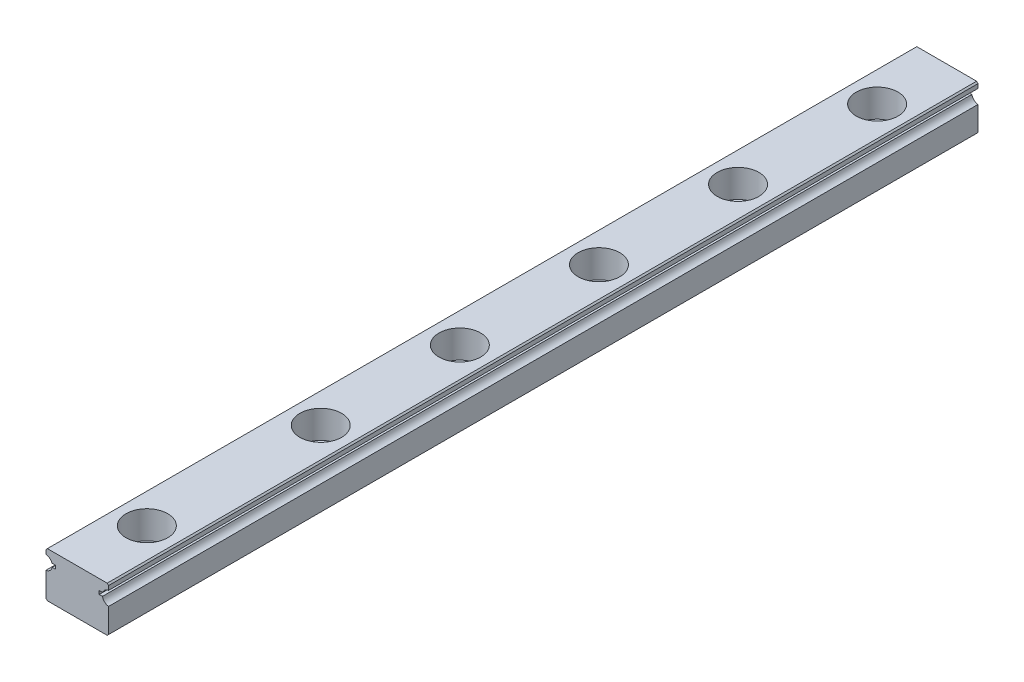
ISO-10303-21;
HEADER;
FILE_DESCRIPTION(('STEP AP214'),'2;1');
FILE_NAME('part.step','',(''),(''),'','','');
FILE_SCHEMA(('AUTOMOTIVE_DESIGN { 1 0 10303 214 1 1 1 1 }'));
ENDSEC;
DATA;
#1=APPLICATION_CONTEXT('core data for automotive mechanical design processes');
#2=APPLICATION_PROTOCOL_DEFINITION('international standard','automotive_design',2000,#1);
#3=PRODUCT_CONTEXT('',#1,'mechanical');
#4=PRODUCT('Part','Part','',(#3));
#5=PRODUCT_RELATED_PRODUCT_CATEGORY('part','',(#4));
#6=PRODUCT_DEFINITION_FORMATION('','',#4);
#7=PRODUCT_DEFINITION_CONTEXT('part definition',#1,'design');
#8=PRODUCT_DEFINITION('design','',#6,#7);
#9=PRODUCT_DEFINITION_SHAPE('','',#8);
#10=(LENGTH_UNIT() NAMED_UNIT(*) SI_UNIT(.MILLI.,.METRE.));
#11=(NAMED_UNIT(*) PLANE_ANGLE_UNIT() SI_UNIT($,.RADIAN.));
#12=(NAMED_UNIT(*) SI_UNIT($,.STERADIAN.) SOLID_ANGLE_UNIT());
#13=UNCERTAINTY_MEASURE_WITH_UNIT(LENGTH_MEASURE(1.E-05),#10,'distance_accuracy_value','');
#14=(GEOMETRIC_REPRESENTATION_CONTEXT(3) GLOBAL_UNCERTAINTY_ASSIGNED_CONTEXT((#13)) GLOBAL_UNIT_ASSIGNED_CONTEXT((#10,
#11,#12)) REPRESENTATION_CONTEXT('',''));
#15=CARTESIAN_POINT('',(0.,0.,0.));
#16=DIRECTION('',(0.,0.,1.));
#17=DIRECTION('',(1.,0.,0.));
#18=AXIS2_PLACEMENT_3D('',#15,#16,#17);
#19=CARTESIAN_POINT('',(-4.3,3.25,125.));
#20=DIRECTION('',(0.,-1.,0.));
#21=DIRECTION('',(0.,0.,-1.));
#22=AXIS2_PLACEMENT_3D('',#19,#20,#21);
#23=PLANE('',#22);
#24=CARTESIAN_POINT('',(1.45716771982052E-13,3.25,90.));
#25=DIRECTION('',(0.,1.,0.));
#26=DIRECTION('',(0.,0.,1.));
#27=AXIS2_PLACEMENT_3D('',#24,#25,#26);
#28=CIRCLE('',#27,3.);
#29=CARTESIAN_POINT('',(1.45716771982052E-13,3.25,93.));
#30=VERTEX_POINT('',#29);
#31=EDGE_CURVE('E717',#30,#30,#28,.T.);
#32=ORIENTED_EDGE('',*,*,#31,.F.);
#33=EDGE_LOOP('',(#32));
#34=FACE_BOUND('',#33,.T.);
#35=CARTESIAN_POINT('',(0.,3.25,50.));
#36=DIRECTION('',(0.,1.,0.));
#37=DIRECTION('',(0.,0.,1.));
#38=AXIS2_PLACEMENT_3D('',#35,#36,#37);
#39=CIRCLE('',#38,3.);
#40=CARTESIAN_POINT('',(0.,3.25,53.));
#41=VERTEX_POINT('',#40);
#42=EDGE_CURVE('E739',#41,#41,#39,.T.);
#43=ORIENTED_EDGE('',*,*,#42,.F.);
#44=EDGE_LOOP('',(#43));
#45=FACE_BOUND('',#44,.T.);
#46=CARTESIAN_POINT('',(0.,3.25,30.));
#47=DIRECTION('',(0.,1.,0.));
#48=DIRECTION('',(0.,0.,1.));
#49=AXIS2_PLACEMENT_3D('',#46,#47,#48);
#50=CIRCLE('',#49,3.);
#51=CARTESIAN_POINT('',(0.,3.25,33.));
#52=VERTEX_POINT('',#51);
#53=EDGE_CURVE('E751',#52,#52,#50,.T.);
#54=ORIENTED_EDGE('',*,*,#53,.F.);
#55=EDGE_LOOP('',(#54));
#56=FACE_BOUND('',#55,.T.);
#57=CARTESIAN_POINT('',(0.,3.25,115.));
#58=DIRECTION('',(0.,1.,0.));
#59=DIRECTION('',(0.,0.,1.));
#60=AXIS2_PLACEMENT_3D('',#57,#58,#59);
#61=CIRCLE('',#60,3.);
#62=CARTESIAN_POINT('',(0.,3.25,118.));
#63=VERTEX_POINT('',#62);
#64=EDGE_CURVE('E763',#63,#63,#61,.T.);
#65=ORIENTED_EDGE('',*,*,#64,.F.);
#66=EDGE_LOOP('',(#65));
#67=FACE_BOUND('',#66,.T.);
#68=CARTESIAN_POINT('',(0.,3.25,10.));
#69=DIRECTION('',(0.,1.,0.));
#70=DIRECTION('',(0.,0.,1.));
#71=AXIS2_PLACEMENT_3D('',#68,#69,#70);
#72=CIRCLE('',#71,3.);
#73=CARTESIAN_POINT('',(0.,3.25,13.));
#74=VERTEX_POINT('',#73);
#75=EDGE_CURVE('E775',#74,#74,#72,.T.);
#76=ORIENTED_EDGE('',*,*,#75,.F.);
#77=EDGE_LOOP('',(#76));
#78=FACE_BOUND('',#77,.T.);
#79=DIRECTION('',(-1.,0.,0.));
#80=VECTOR('',#79,1.);
#81=CARTESIAN_POINT('',(-4.3,3.25,0.));
#82=LINE('',#81,#80);
#83=CARTESIAN_POINT('',(4.3,3.25,0.));
#84=VERTEX_POINT('',#83);
#85=CARTESIAN_POINT('',(-4.3,3.25,0.));
#86=VERTEX_POINT('',#85);
#87=EDGE_CURVE('E200',#84,#86,#82,.T.);
#88=ORIENTED_EDGE('',*,*,#87,.T.);
#89=DIRECTION('',(0.,0.,-1.));
#90=VECTOR('',#89,1.);
#91=CARTESIAN_POINT('',(-4.3,3.25,125.));
#92=LINE('',#91,#90);
#93=CARTESIAN_POINT('',(-4.3,3.25,125.));
#94=VERTEX_POINT('',#93);
#95=EDGE_CURVE('E197',#94,#86,#92,.T.);
#96=ORIENTED_EDGE('',*,*,#95,.F.);
#97=DIRECTION('',(-1.,0.,0.));
#98=VECTOR('',#97,1.);
#99=CARTESIAN_POINT('',(-4.3,3.25,125.));
#100=LINE('',#99,#98);
#101=CARTESIAN_POINT('',(4.3,3.25,125.));
#102=VERTEX_POINT('',#101);
#103=EDGE_CURVE('E186',#102,#94,#100,.T.);
#104=ORIENTED_EDGE('',*,*,#103,.F.);
#105=DIRECTION('',(0.,0.,-1.));
#106=VECTOR('',#105,1.);
#107=CARTESIAN_POINT('',(4.3,3.25,125.));
#108=LINE('',#107,#106);
#109=EDGE_CURVE('E201',#102,#84,#108,.T.);
#110=ORIENTED_EDGE('',*,*,#109,.T.);
#111=EDGE_LOOP('',(#88,#96,#104,#110));
#112=FACE_BOUND('',#111,.T.);
#113=CARTESIAN_POINT('',(0.,3.25,70.));
#114=DIRECTION('',(0.,1.,0.));
#115=DIRECTION('',(0.,0.,1.));
#116=AXIS2_PLACEMENT_3D('',#113,#114,#115);
#117=CIRCLE('',#116,3.);
#118=CARTESIAN_POINT('',(0.,3.25,73.));
#119=VERTEX_POINT('',#118);
#120=EDGE_CURVE('E727',#119,#119,#117,.T.);
#121=ORIENTED_EDGE('',*,*,#120,.F.);
#122=EDGE_LOOP('',(#121));
#123=FACE_BOUND('',#122,.T.);
#124=ADVANCED_FACE('F41',(#34,#45,#56,#67,#78,#112,#123),#23,.F.);
#125=CARTESIAN_POINT('',(-4.6,1.45,125.));
#126=DIRECTION('',(0.,0.,-1.));
#127=DIRECTION('',(-1.,0.,0.));
#128=AXIS2_PLACEMENT_3D('',#125,#126,#127);
#129=CYLINDRICAL_SURFACE('',#128,1.);
#130=CARTESIAN_POINT('',(-4.6,1.45,0.));
#131=DIRECTION('',(0.,0.,-1.));
#132=DIRECTION('',(-1.,0.,0.));
#133=AXIS2_PLACEMENT_3D('',#130,#131,#132);
#134=CIRCLE('',#133,1.);
#135=CARTESIAN_POINT('',(-4.5,2.44498743710662,0.));
#136=VERTEX_POINT('',#135);
#137=CARTESIAN_POINT('',(-3.65008224040183,1.7625,0.));
#138=VERTEX_POINT('',#137);
#139=EDGE_CURVE('E210',#136,#138,#134,.T.);
#140=ORIENTED_EDGE('',*,*,#139,.T.);
#141=DIRECTION('',(0.,0.,-1.));
#142=VECTOR('',#141,1.);
#143=CARTESIAN_POINT('',(-3.65008224040183,1.7625,125.));
#144=LINE('',#143,#142);
#145=CARTESIAN_POINT('',(-3.65008224040183,1.7625,125.));
#146=VERTEX_POINT('',#145);
#147=EDGE_CURVE('E12',#146,#138,#144,.T.);
#148=ORIENTED_EDGE('',*,*,#147,.F.);
#149=CARTESIAN_POINT('',(-4.6,1.45,125.));
#150=DIRECTION('',(0.,0.,-1.));
#151=DIRECTION('',(-1.,0.,0.));
#152=AXIS2_PLACEMENT_3D('',#149,#150,#151);
#153=CIRCLE('',#152,1.);
#154=CARTESIAN_POINT('',(-4.5,2.44498743710662,125.));
#155=VERTEX_POINT('',#154);
#156=EDGE_CURVE('E249',#155,#146,#153,.T.);
#157=ORIENTED_EDGE('',*,*,#156,.F.);
#158=DIRECTION('',(0.,0.,-1.));
#159=VECTOR('',#158,1.);
#160=CARTESIAN_POINT('',(-4.5,2.44498743710662,125.));
#161=LINE('',#160,#159);
#162=EDGE_CURVE('E206',#155,#136,#161,.T.);
#163=ORIENTED_EDGE('',*,*,#162,.T.);
#164=EDGE_LOOP('',(#140,#148,#157,#163));
#165=FACE_BOUND('',#164,.T.);
#166=ADVANCED_FACE('F43',(#165),#129,.F.);
#167=CARTESIAN_POINT('',(-3.65008224040183,1.7625,125.));
#168=DIRECTION('',(0.,1.,0.));
#169=DIRECTION('',(0.,0.,1.));
#170=AXIS2_PLACEMENT_3D('',#167,#168,#169);
#171=PLANE('',#170);
#172=DIRECTION('',(1.,0.,0.));
#173=VECTOR('',#172,1.);
#174=CARTESIAN_POINT('',(-3.65008224040183,1.7625,0.));
#175=LINE('',#174,#173);
#176=CARTESIAN_POINT('',(-3.15008224040183,1.7625,0.));
#177=VERTEX_POINT('',#176);
#178=EDGE_CURVE('E213',#138,#177,#175,.T.);
#179=ORIENTED_EDGE('',*,*,#178,.T.);
#180=DIRECTION('',(0.,0.,-1.));
#181=VECTOR('',#180,1.);
#182=CARTESIAN_POINT('',(-3.15008224040183,1.7625,125.));
#183=LINE('',#182,#181);
#184=CARTESIAN_POINT('',(-3.15008224040183,1.7625,125.));
#185=VERTEX_POINT('',#184);
#186=EDGE_CURVE('E50',#185,#177,#183,.T.);
#187=ORIENTED_EDGE('',*,*,#186,.F.);
#188=DIRECTION('',(1.,0.,0.));
#189=VECTOR('',#188,1.);
#190=CARTESIAN_POINT('',(-3.65008224040183,1.7625,125.));
#191=LINE('',#190,#189);
#192=EDGE_CURVE('E137',#146,#185,#191,.T.);
#193=ORIENTED_EDGE('',*,*,#192,.F.);
#194=ORIENTED_EDGE('',*,*,#147,.T.);
#195=EDGE_LOOP('',(#179,#187,#193,#194));
#196=FACE_BOUND('',#195,.T.);
#197=ADVANCED_FACE('F384',(#196),#171,.F.);
#198=CARTESIAN_POINT('',(-3.15008224040183,1.2625,125.));
#199=DIRECTION('',(1.,0.,0.));
#200=DIRECTION('',(0.,0.,-1.));
#201=AXIS2_PLACEMENT_3D('',#198,#199,#200);
#202=PLANE('',#201);
#203=DIRECTION('',(0.,-1.,0.));
#204=VECTOR('',#203,1.);
#205=CARTESIAN_POINT('',(-3.15008224040183,1.2625,0.));
#206=LINE('',#205,#204);
#207=CARTESIAN_POINT('',(-3.15008224040183,1.2625,0.));
#208=VERTEX_POINT('',#207);
#209=EDGE_CURVE('E216',#177,#208,#206,.T.);
#210=ORIENTED_EDGE('',*,*,#209,.T.);
#211=DIRECTION('',(0.,0.,-1.));
#212=VECTOR('',#211,1.);
#213=CARTESIAN_POINT('',(-3.15008224040183,1.2625,125.));
#214=LINE('',#213,#212);
#215=CARTESIAN_POINT('',(-3.15008224040183,1.2625,125.));
#216=VERTEX_POINT('',#215);
#217=EDGE_CURVE('E304',#216,#208,#214,.T.);
#218=ORIENTED_EDGE('',*,*,#217,.F.);
#219=DIRECTION('',(0.,-1.,0.));
#220=VECTOR('',#219,1.);
#221=CARTESIAN_POINT('',(-3.15008224040183,1.2625,125.));
#222=LINE('',#221,#220);
#223=EDGE_CURVE('E312',#185,#216,#222,.T.);
#224=ORIENTED_EDGE('',*,*,#223,.F.);
#225=ORIENTED_EDGE('',*,*,#186,.T.);
#226=EDGE_LOOP('',(#210,#218,#224,#225));
#227=FACE_BOUND('',#226,.T.);
#228=ADVANCED_FACE('F310',(#227),#202,.F.);
#229=CARTESIAN_POINT('',(-3.61773539715614,1.2625,125.));
#230=DIRECTION('',(0.,-1.,0.));
#231=DIRECTION('',(0.,0.,-1.));
#232=AXIS2_PLACEMENT_3D('',#229,#230,#231);
#233=PLANE('',#232);
#234=DIRECTION('',(-1.,0.,0.));
#235=VECTOR('',#234,1.);
#236=CARTESIAN_POINT('',(-3.61773539715614,1.2625,0.));
#237=LINE('',#236,#235);
#238=CARTESIAN_POINT('',(-3.61773539715614,1.2625,0.));
#239=VERTEX_POINT('',#238);
#240=EDGE_CURVE('E218',#208,#239,#237,.T.);
#241=ORIENTED_EDGE('',*,*,#240,.T.);
#242=DIRECTION('',(0.,0.,-1.));
#243=VECTOR('',#242,1.);
#244=CARTESIAN_POINT('',(-3.61773539715614,1.2625,125.));
#245=LINE('',#244,#243);
#246=CARTESIAN_POINT('',(-3.61773539715614,1.2625,125.));
#247=VERTEX_POINT('',#246);
#248=EDGE_CURVE('E301',#247,#239,#245,.T.);
#249=ORIENTED_EDGE('',*,*,#248,.F.);
#250=DIRECTION('',(-1.,0.,0.));
#251=VECTOR('',#250,1.);
#252=CARTESIAN_POINT('',(-3.61773539715614,1.2625,125.));
#253=LINE('',#252,#251);
#254=EDGE_CURVE('E330',#216,#247,#253,.T.);
#255=ORIENTED_EDGE('',*,*,#254,.F.);
#256=ORIENTED_EDGE('',*,*,#217,.T.);
#257=EDGE_LOOP('',(#241,#249,#255,#256));
#258=FACE_BOUND('',#257,.T.);
#259=ADVANCED_FACE('F321',(#258),#233,.F.);
#260=CARTESIAN_POINT('',(-4.6,1.45,125.));
#261=DIRECTION('',(0.,0.,-1.));
#262=DIRECTION('',(-1.,0.,0.));
#263=AXIS2_PLACEMENT_3D('',#260,#261,#262);
#264=CYLINDRICAL_SURFACE('',#263,1.);
#265=CARTESIAN_POINT('',(-4.6,1.45,0.));
#266=DIRECTION('',(0.,0.,-1.));
#267=DIRECTION('',(-1.,0.,0.));
#268=AXIS2_PLACEMENT_3D('',#265,#266,#267);
#269=CIRCLE('',#268,1.);
#270=CARTESIAN_POINT('',(-4.5,0.455012562893381,0.));
#271=VERTEX_POINT('',#270);
#272=EDGE_CURVE('E220',#239,#271,#269,.T.);
#273=ORIENTED_EDGE('',*,*,#272,.T.);
#274=DIRECTION('',(0.,0.,-1.));
#275=VECTOR('',#274,1.);
#276=CARTESIAN_POINT('',(-4.5,0.455012562893381,125.));
#277=LINE('',#276,#275);
#278=CARTESIAN_POINT('',(-4.5,0.455012562893381,125.));
#279=VERTEX_POINT('',#278);
#280=EDGE_CURVE('E298',#279,#271,#277,.T.);
#281=ORIENTED_EDGE('',*,*,#280,.F.);
#282=CARTESIAN_POINT('',(-4.6,1.45,125.));
#283=DIRECTION('',(0.,0.,-1.));
#284=DIRECTION('',(-1.,0.,0.));
#285=AXIS2_PLACEMENT_3D('',#282,#283,#284);
#286=CIRCLE('',#285,1.);
#287=EDGE_CURVE('E327',#247,#279,#286,.T.);
#288=ORIENTED_EDGE('',*,*,#287,.F.);
#289=ORIENTED_EDGE('',*,*,#248,.T.);
#290=EDGE_LOOP('',(#273,#281,#288,#289));
#291=FACE_BOUND('',#290,.T.);
#292=ADVANCED_FACE('F325',(#291),#264,.F.);
#293=CARTESIAN_POINT('',(-4.5,-3.05,125.));
#294=DIRECTION('',(1.,0.,0.));
#295=DIRECTION('',(0.,1.,0.));
#296=AXIS2_PLACEMENT_3D('',#293,#294,#295);
#297=PLANE('',#296);
#298=DIRECTION('',(0.,-1.,0.));
#299=VECTOR('',#298,1.);
#300=CARTESIAN_POINT('',(-4.5,-3.05,0.));
#301=LINE('',#300,#299);
#302=CARTESIAN_POINT('',(-4.5,-3.05,0.));
#303=VERTEX_POINT('',#302);
#304=EDGE_CURVE('E222',#271,#303,#301,.T.);
#305=ORIENTED_EDGE('',*,*,#304,.T.);
#306=DIRECTION('',(0.,0.,-1.));
#307=VECTOR('',#306,1.);
#308=CARTESIAN_POINT('',(-4.5,-3.05,125.));
#309=LINE('',#308,#307);
#310=CARTESIAN_POINT('',(-4.5,-3.05,125.));
#311=VERTEX_POINT('',#310);
#312=EDGE_CURVE('E294',#311,#303,#309,.T.);
#313=ORIENTED_EDGE('',*,*,#312,.F.);
#314=DIRECTION('',(0.,-1.,0.));
#315=VECTOR('',#314,1.);
#316=CARTESIAN_POINT('',(-4.5,-3.05,125.));
#317=LINE('',#316,#315);
#318=EDGE_CURVE('E329',#279,#311,#317,.T.);
#319=ORIENTED_EDGE('',*,*,#318,.F.);
#320=ORIENTED_EDGE('',*,*,#280,.T.);
#321=EDGE_LOOP('',(#305,#313,#319,#320));
#322=FACE_BOUND('',#321,.T.);
#323=ADVANCED_FACE('F427',(#322),#297,.F.);
#324=CARTESIAN_POINT('',(-4.5,-3.05,125.));
#325=DIRECTION('',(0.707106781186549,0.707106781186546,0.));
#326=DIRECTION('',(-0.707106781186546,0.707106781186549,0.));
#327=AXIS2_PLACEMENT_3D('',#324,#325,#326);
#328=PLANE('',#327);
#329=DIRECTION('',(0.707106781186546,-0.707106781186549,0.));
#330=VECTOR('',#329,1.);
#331=CARTESIAN_POINT('',(-4.5,-3.05,0.));
#332=LINE('',#331,#330);
#333=CARTESIAN_POINT('',(-4.3,-3.25,0.));
#334=VERTEX_POINT('',#333);
#335=EDGE_CURVE('E224',#303,#334,#332,.T.);
#336=ORIENTED_EDGE('',*,*,#335,.T.);
#337=DIRECTION('',(0.,0.,-1.));
#338=VECTOR('',#337,1.);
#339=CARTESIAN_POINT('',(-4.3,-3.25,125.));
#340=LINE('',#339,#338);
#341=CARTESIAN_POINT('',(-4.3,-3.25,125.));
#342=VERTEX_POINT('',#341);
#343=EDGE_CURVE('E290',#342,#334,#340,.T.);
#344=ORIENTED_EDGE('',*,*,#343,.F.);
#345=DIRECTION('',(0.707106781186546,-0.707106781186549,0.));
#346=VECTOR('',#345,1.);
#347=CARTESIAN_POINT('',(-4.5,-3.05,125.));
#348=LINE('',#347,#346);
#349=EDGE_CURVE('E332',#311,#342,#348,.T.);
#350=ORIENTED_EDGE('',*,*,#349,.F.);
#351=ORIENTED_EDGE('',*,*,#312,.T.);
#352=EDGE_LOOP('',(#336,#344,#350,#351));
#353=FACE_BOUND('',#352,.T.);
#354=ADVANCED_FACE('F423',(#353),#328,.F.);
#355=CARTESIAN_POINT('',(-4.3,-3.25,125.));
#356=DIRECTION('',(0.,1.,0.));
#357=DIRECTION('',(0.,0.,1.));
#358=AXIS2_PLACEMENT_3D('',#355,#356,#357);
#359=PLANE('',#358);
#360=CARTESIAN_POINT('',(1.45716771982052E-13,-3.25,90.));
#361=DIRECTION('',(0.,1.,0.));
#362=DIRECTION('',(0.,0.,1.));
#363=AXIS2_PLACEMENT_3D('',#360,#361,#362);
#364=CIRCLE('',#363,1.75);
#365=CARTESIAN_POINT('',(1.45716771982052E-13,-3.25,91.75));
#366=VERTEX_POINT('',#365);
#367=EDGE_CURVE('E724',#366,#366,#364,.T.);
#368=ORIENTED_EDGE('',*,*,#367,.T.);
#369=EDGE_LOOP('',(#368));
#370=FACE_BOUND('',#369,.T.);
#371=CARTESIAN_POINT('',(0.,-3.25,70.));
#372=DIRECTION('',(0.,1.,0.));
#373=DIRECTION('',(0.,0.,1.));
#374=AXIS2_PLACEMENT_3D('',#371,#372,#373);
#375=CIRCLE('',#374,1.75);
#376=CARTESIAN_POINT('',(0.,-3.25,71.75));
#377=VERTEX_POINT('',#376);
#378=EDGE_CURVE('E736',#377,#377,#375,.T.);
#379=ORIENTED_EDGE('',*,*,#378,.T.);
#380=EDGE_LOOP('',(#379));
#381=FACE_BOUND('',#380,.T.);
#382=CARTESIAN_POINT('',(0.,-3.25,50.));
#383=DIRECTION('',(0.,1.,0.));
#384=DIRECTION('',(0.,0.,1.));
#385=AXIS2_PLACEMENT_3D('',#382,#383,#384);
#386=CIRCLE('',#385,1.75);
#387=CARTESIAN_POINT('',(0.,-3.25,51.75));
#388=VERTEX_POINT('',#387);
#389=EDGE_CURVE('E748',#388,#388,#386,.T.);
#390=ORIENTED_EDGE('',*,*,#389,.T.);
#391=EDGE_LOOP('',(#390));
#392=FACE_BOUND('',#391,.T.);
#393=CARTESIAN_POINT('',(0.,-3.25,30.));
#394=DIRECTION('',(0.,1.,0.));
#395=DIRECTION('',(0.,0.,1.));
#396=AXIS2_PLACEMENT_3D('',#393,#394,#395);
#397=CIRCLE('',#396,1.75);
#398=CARTESIAN_POINT('',(0.,-3.25,31.75));
#399=VERTEX_POINT('',#398);
#400=EDGE_CURVE('E760',#399,#399,#397,.T.);
#401=ORIENTED_EDGE('',*,*,#400,.T.);
#402=EDGE_LOOP('',(#401));
#403=FACE_BOUND('',#402,.T.);
#404=CARTESIAN_POINT('',(0.,-3.25,115.));
#405=DIRECTION('',(0.,1.,0.));
#406=DIRECTION('',(0.,0.,1.));
#407=AXIS2_PLACEMENT_3D('',#404,#405,#406);
#408=CIRCLE('',#407,1.75);
#409=CARTESIAN_POINT('',(0.,-3.25,116.75));
#410=VERTEX_POINT('',#409);
#411=EDGE_CURVE('E772',#410,#410,#408,.T.);
#412=ORIENTED_EDGE('',*,*,#411,.T.);
#413=EDGE_LOOP('',(#412));
#414=FACE_BOUND('',#413,.T.);
#415=CARTESIAN_POINT('',(0.,-3.25,10.));
#416=DIRECTION('',(0.,1.,0.));
#417=DIRECTION('',(0.,0.,1.));
#418=AXIS2_PLACEMENT_3D('',#415,#416,#417);
#419=CIRCLE('',#418,1.75);
#420=CARTESIAN_POINT('',(0.,-3.25,11.75));
#421=VERTEX_POINT('',#420);
#422=EDGE_CURVE('E214',#421,#421,#419,.T.);
#423=ORIENTED_EDGE('',*,*,#422,.T.);
#424=EDGE_LOOP('',(#423));
#425=FACE_BOUND('',#424,.T.);
#426=DIRECTION('',(1.,0.,0.));
#427=VECTOR('',#426,1.);
#428=CARTESIAN_POINT('',(-4.3,-3.25,0.));
#429=LINE('',#428,#427);
#430=CARTESIAN_POINT('',(4.3,-3.25,0.));
#431=VERTEX_POINT('',#430);
#432=EDGE_CURVE('E226',#334,#431,#429,.T.);
#433=ORIENTED_EDGE('',*,*,#432,.T.);
#434=DIRECTION('',(0.,0.,-1.));
#435=VECTOR('',#434,1.);
#436=CARTESIAN_POINT('',(4.3,-3.25,125.));
#437=LINE('',#436,#435);
#438=CARTESIAN_POINT('',(4.3,-3.25,125.));
#439=VERTEX_POINT('',#438);
#440=EDGE_CURVE('E286',#439,#431,#437,.T.);
#441=ORIENTED_EDGE('',*,*,#440,.F.);
#442=DIRECTION('',(1.,0.,0.));
#443=VECTOR('',#442,1.);
#444=CARTESIAN_POINT('',(-4.3,-3.25,125.));
#445=LINE('',#444,#443);
#446=EDGE_CURVE('E338',#342,#439,#445,.T.);
#447=ORIENTED_EDGE('',*,*,#446,.F.);
#448=ORIENTED_EDGE('',*,*,#343,.T.);
#449=EDGE_LOOP('',(#433,#441,#447,#448));
#450=FACE_BOUND('',#449,.T.);
#451=ADVANCED_FACE('F419',(#370,#381,#392,#403,#414,#425,#450),#359,.F.);
#452=CARTESIAN_POINT('',(4.3,-3.25,125.));
#453=DIRECTION('',(-0.707106781186547,0.707106781186548,0.));
#454=DIRECTION('',(-0.707106781186548,-0.707106781186547,0.));
#455=AXIS2_PLACEMENT_3D('',#452,#453,#454);
#456=PLANE('',#455);
#457=DIRECTION('',(0.707106781186548,0.707106781186547,0.));
#458=VECTOR('',#457,1.);
#459=CARTESIAN_POINT('',(4.3,-3.25,0.));
#460=LINE('',#459,#458);
#461=CARTESIAN_POINT('',(4.5,-3.05,0.));
#462=VERTEX_POINT('',#461);
#463=EDGE_CURVE('E228',#431,#462,#460,.T.);
#464=ORIENTED_EDGE('',*,*,#463,.T.);
#465=DIRECTION('',(0.,0.,-1.));
#466=VECTOR('',#465,1.);
#467=CARTESIAN_POINT('',(4.5,-3.05,125.));
#468=LINE('',#467,#466);
#469=CARTESIAN_POINT('',(4.5,-3.05,125.));
#470=VERTEX_POINT('',#469);
#471=EDGE_CURVE('E282',#470,#462,#468,.T.);
#472=ORIENTED_EDGE('',*,*,#471,.F.);
#473=DIRECTION('',(0.707106781186548,0.707106781186547,0.));
#474=VECTOR('',#473,1.);
#475=CARTESIAN_POINT('',(4.3,-3.25,125.));
#476=LINE('',#475,#474);
#477=EDGE_CURVE('E340',#439,#470,#476,.T.);
#478=ORIENTED_EDGE('',*,*,#477,.F.);
#479=ORIENTED_EDGE('',*,*,#440,.T.);
#480=EDGE_LOOP('',(#464,#472,#478,#479));
#481=FACE_BOUND('',#480,.T.);
#482=ADVANCED_FACE('F415',(#481),#456,.F.);
#483=CARTESIAN_POINT('',(4.5,-3.05,125.));
#484=DIRECTION('',(-1.,0.,0.));
#485=DIRECTION('',(0.,-1.,0.));
#486=AXIS2_PLACEMENT_3D('',#483,#484,#485);
#487=PLANE('',#486);
#488=DIRECTION('',(0.,1.,0.));
#489=VECTOR('',#488,1.);
#490=CARTESIAN_POINT('',(4.5,-3.05,0.));
#491=LINE('',#490,#489);
#492=CARTESIAN_POINT('',(4.5,0.455012562893381,0.));
#493=VERTEX_POINT('',#492);
#494=EDGE_CURVE('E230',#462,#493,#491,.T.);
#495=ORIENTED_EDGE('',*,*,#494,.T.);
#496=DIRECTION('',(0.,0.,-1.));
#497=VECTOR('',#496,1.);
#498=CARTESIAN_POINT('',(4.5,0.455012562893381,125.));
#499=LINE('',#498,#497);
#500=CARTESIAN_POINT('',(4.5,0.455012562893381,125.));
#501=VERTEX_POINT('',#500);
#502=EDGE_CURVE('E278',#501,#493,#499,.T.);
#503=ORIENTED_EDGE('',*,*,#502,.F.);
#504=DIRECTION('',(0.,1.,0.));
#505=VECTOR('',#504,1.);
#506=CARTESIAN_POINT('',(4.5,-3.05,125.));
#507=LINE('',#506,#505);
#508=EDGE_CURVE('E342',#470,#501,#507,.T.);
#509=ORIENTED_EDGE('',*,*,#508,.F.);
#510=ORIENTED_EDGE('',*,*,#471,.T.);
#511=EDGE_LOOP('',(#495,#503,#509,#510));
#512=FACE_BOUND('',#511,.T.);
#513=ADVANCED_FACE('F411',(#512),#487,.F.);
#514=CARTESIAN_POINT('',(4.6,1.45,125.));
#515=DIRECTION('',(0.,0.,-1.));
#516=DIRECTION('',(-1.,0.,0.));
#517=AXIS2_PLACEMENT_3D('',#514,#515,#516);
#518=CYLINDRICAL_SURFACE('',#517,1.);
#519=CARTESIAN_POINT('',(4.6,1.45,0.));
#520=DIRECTION('',(0.,0.,-1.));
#521=DIRECTION('',(1.,0.,0.));
#522=AXIS2_PLACEMENT_3D('',#519,#520,#521);
#523=CIRCLE('',#522,1.);
#524=CARTESIAN_POINT('',(3.61773539715614,1.2625,0.));
#525=VERTEX_POINT('',#524);
#526=EDGE_CURVE('E232',#493,#525,#523,.T.);
#527=ORIENTED_EDGE('',*,*,#526,.T.);
#528=DIRECTION('',(0.,0.,-1.));
#529=VECTOR('',#528,1.);
#530=CARTESIAN_POINT('',(3.61773539715614,1.2625,125.));
#531=LINE('',#530,#529);
#532=CARTESIAN_POINT('',(3.61773539715614,1.2625,125.));
#533=VERTEX_POINT('',#532);
#534=EDGE_CURVE('E274',#533,#525,#531,.T.);
#535=ORIENTED_EDGE('',*,*,#534,.F.);
#536=CARTESIAN_POINT('',(4.6,1.45,125.));
#537=DIRECTION('',(0.,0.,-1.));
#538=DIRECTION('',(1.,0.,0.));
#539=AXIS2_PLACEMENT_3D('',#536,#537,#538);
#540=CIRCLE('',#539,1.);
#541=EDGE_CURVE('E344',#501,#533,#540,.T.);
#542=ORIENTED_EDGE('',*,*,#541,.F.);
#543=ORIENTED_EDGE('',*,*,#502,.T.);
#544=EDGE_LOOP('',(#527,#535,#542,#543));
#545=FACE_BOUND('',#544,.T.);
#546=ADVANCED_FACE('F407',(#545),#518,.F.);
#547=CARTESIAN_POINT('',(3.61773539715614,1.2625,125.));
#548=DIRECTION('',(0.,-1.,0.));
#549=DIRECTION('',(0.,0.,-1.));
#550=AXIS2_PLACEMENT_3D('',#547,#548,#549);
#551=PLANE('',#550);
#552=DIRECTION('',(-1.,0.,0.));
#553=VECTOR('',#552,1.);
#554=CARTESIAN_POINT('',(3.61773539715614,1.2625,0.));
#555=LINE('',#554,#553);
#556=CARTESIAN_POINT('',(3.15008224040183,1.2625,0.));
#557=VERTEX_POINT('',#556);
#558=EDGE_CURVE('E234',#525,#557,#555,.T.);
#559=ORIENTED_EDGE('',*,*,#558,.T.);
#560=DIRECTION('',(0.,0.,-1.));
#561=VECTOR('',#560,1.);
#562=CARTESIAN_POINT('',(3.15008224040183,1.2625,125.));
#563=LINE('',#562,#561);
#564=CARTESIAN_POINT('',(3.15008224040183,1.2625,125.));
#565=VERTEX_POINT('',#564);
#566=EDGE_CURVE('E270',#565,#557,#563,.T.);
#567=ORIENTED_EDGE('',*,*,#566,.F.);
#568=DIRECTION('',(-1.,0.,0.));
#569=VECTOR('',#568,1.);
#570=CARTESIAN_POINT('',(3.61773539715614,1.2625,125.));
#571=LINE('',#570,#569);
#572=EDGE_CURVE('E346',#533,#565,#571,.T.);
#573=ORIENTED_EDGE('',*,*,#572,.F.);
#574=ORIENTED_EDGE('',*,*,#534,.T.);
#575=EDGE_LOOP('',(#559,#567,#573,#574));
#576=FACE_BOUND('',#575,.T.);
#577=ADVANCED_FACE('F403',(#576),#551,.F.);
#578=CARTESIAN_POINT('',(3.15008224040183,1.2625,125.));
#579=DIRECTION('',(-1.,0.,0.));
#580=DIRECTION('',(0.,0.,1.));
#581=AXIS2_PLACEMENT_3D('',#578,#579,#580);
#582=PLANE('',#581);
#583=DIRECTION('',(0.,1.,0.));
#584=VECTOR('',#583,1.);
#585=CARTESIAN_POINT('',(3.15008224040183,1.2625,0.));
#586=LINE('',#585,#584);
#587=CARTESIAN_POINT('',(3.15008224040183,1.7625,0.));
#588=VERTEX_POINT('',#587);
#589=EDGE_CURVE('E236',#557,#588,#586,.T.);
#590=ORIENTED_EDGE('',*,*,#589,.T.);
#591=DIRECTION('',(0.,0.,-1.));
#592=VECTOR('',#591,1.);
#593=CARTESIAN_POINT('',(3.15008224040183,1.7625,125.));
#594=LINE('',#593,#592);
#595=CARTESIAN_POINT('',(3.15008224040183,1.7625,125.));
#596=VERTEX_POINT('',#595);
#597=EDGE_CURVE('E266',#596,#588,#594,.T.);
#598=ORIENTED_EDGE('',*,*,#597,.F.);
#599=DIRECTION('',(0.,1.,0.));
#600=VECTOR('',#599,1.);
#601=CARTESIAN_POINT('',(3.15008224040183,1.2625,125.));
#602=LINE('',#601,#600);
#603=EDGE_CURVE('E348',#565,#596,#602,.T.);
#604=ORIENTED_EDGE('',*,*,#603,.F.);
#605=ORIENTED_EDGE('',*,*,#566,.T.);
#606=EDGE_LOOP('',(#590,#598,#604,#605));
#607=FACE_BOUND('',#606,.T.);
#608=ADVANCED_FACE('F399',(#607),#582,.F.);
#609=CARTESIAN_POINT('',(3.65008224040183,1.7625,125.));
#610=DIRECTION('',(0.,1.,0.));
#611=DIRECTION('',(0.,0.,1.));
#612=AXIS2_PLACEMENT_3D('',#609,#610,#611);
#613=PLANE('',#612);
#614=DIRECTION('',(1.,0.,0.));
#615=VECTOR('',#614,1.);
#616=CARTESIAN_POINT('',(3.65008224040183,1.7625,0.));
#617=LINE('',#616,#615);
#618=CARTESIAN_POINT('',(3.65008224040183,1.7625,0.));
#619=VERTEX_POINT('',#618);
#620=EDGE_CURVE('E238',#588,#619,#617,.T.);
#621=ORIENTED_EDGE('',*,*,#620,.T.);
#622=DIRECTION('',(0.,0.,-1.));
#623=VECTOR('',#622,1.);
#624=CARTESIAN_POINT('',(3.65008224040183,1.7625,125.));
#625=LINE('',#624,#623);
#626=CARTESIAN_POINT('',(3.65008224040183,1.7625,125.));
#627=VERTEX_POINT('',#626);
#628=EDGE_CURVE('E262',#627,#619,#625,.T.);
#629=ORIENTED_EDGE('',*,*,#628,.F.);
#630=DIRECTION('',(1.,0.,0.));
#631=VECTOR('',#630,1.);
#632=CARTESIAN_POINT('',(3.65008224040183,1.7625,125.));
#633=LINE('',#632,#631);
#634=EDGE_CURVE('E350',#596,#627,#633,.T.);
#635=ORIENTED_EDGE('',*,*,#634,.F.);
#636=ORIENTED_EDGE('',*,*,#597,.T.);
#637=EDGE_LOOP('',(#621,#629,#635,#636));
#638=FACE_BOUND('',#637,.T.);
#639=ADVANCED_FACE('F395',(#638),#613,.F.);
#640=CARTESIAN_POINT('',(4.6,1.45,125.));
#641=DIRECTION('',(0.,0.,-1.));
#642=DIRECTION('',(-1.,0.,0.));
#643=AXIS2_PLACEMENT_3D('',#640,#641,#642);
#644=CYLINDRICAL_SURFACE('',#643,1.);
#645=CARTESIAN_POINT('',(4.6,1.45,0.));
#646=DIRECTION('',(0.,0.,-1.));
#647=DIRECTION('',(1.,0.,0.));
#648=AXIS2_PLACEMENT_3D('',#645,#646,#647);
#649=CIRCLE('',#648,1.);
#650=CARTESIAN_POINT('',(4.5,2.44498743710662,0.));
#651=VERTEX_POINT('',#650);
#652=EDGE_CURVE('E240',#619,#651,#649,.T.);
#653=ORIENTED_EDGE('',*,*,#652,.T.);
#654=DIRECTION('',(0.,0.,-1.));
#655=VECTOR('',#654,1.);
#656=CARTESIAN_POINT('',(4.5,2.44498743710662,125.));
#657=LINE('',#656,#655);
#658=CARTESIAN_POINT('',(4.5,2.44498743710662,125.));
#659=VERTEX_POINT('',#658);
#660=EDGE_CURVE('E258',#659,#651,#657,.T.);
#661=ORIENTED_EDGE('',*,*,#660,.F.);
#662=CARTESIAN_POINT('',(4.6,1.45,125.));
#663=DIRECTION('',(0.,0.,-1.));
#664=DIRECTION('',(1.,0.,0.));
#665=AXIS2_PLACEMENT_3D('',#662,#663,#664);
#666=CIRCLE('',#665,1.);
#667=EDGE_CURVE('E352',#627,#659,#666,.T.);
#668=ORIENTED_EDGE('',*,*,#667,.F.);
#669=ORIENTED_EDGE('',*,*,#628,.T.);
#670=EDGE_LOOP('',(#653,#661,#668,#669));
#671=FACE_BOUND('',#670,.T.);
#672=ADVANCED_FACE('F392',(#671),#644,.F.);
#673=CARTESIAN_POINT('',(4.5,2.44498743710662,125.));
#674=DIRECTION('',(-1.,0.,0.));
#675=DIRECTION('',(0.,-1.,0.));
#676=AXIS2_PLACEMENT_3D('',#673,#674,#675);
#677=PLANE('',#676);
#678=DIRECTION('',(0.,1.,0.));
#679=VECTOR('',#678,1.);
#680=CARTESIAN_POINT('',(4.5,2.44498743710662,0.));
#681=LINE('',#680,#679);
#682=CARTESIAN_POINT('',(4.5,3.05,0.));
#683=VERTEX_POINT('',#682);
#684=EDGE_CURVE('E242',#651,#683,#681,.T.);
#685=ORIENTED_EDGE('',*,*,#684,.T.);
#686=DIRECTION('',(0.,0.,-1.));
#687=VECTOR('',#686,1.);
#688=CARTESIAN_POINT('',(4.5,3.05,125.));
#689=LINE('',#688,#687);
#690=CARTESIAN_POINT('',(4.5,3.05,125.));
#691=VERTEX_POINT('',#690);
#692=EDGE_CURVE('E254',#691,#683,#689,.T.);
#693=ORIENTED_EDGE('',*,*,#692,.F.);
#694=DIRECTION('',(0.,1.,0.));
#695=VECTOR('',#694,1.);
#696=CARTESIAN_POINT('',(4.5,2.44498743710662,125.));
#697=LINE('',#696,#695);
#698=EDGE_CURVE('E354',#659,#691,#697,.T.);
#699=ORIENTED_EDGE('',*,*,#698,.F.);
#700=ORIENTED_EDGE('',*,*,#660,.T.);
#701=EDGE_LOOP('',(#685,#693,#699,#700));
#702=FACE_BOUND('',#701,.T.);
#703=ADVANCED_FACE('F360',(#702),#677,.F.);
#704=CARTESIAN_POINT('',(4.3,3.25,125.));
#705=DIRECTION('',(-0.707106781186548,-0.707106781186548,0.));
#706=DIRECTION('',(0.707106781186548,-0.707106781186548,0.));
#707=AXIS2_PLACEMENT_3D('',#704,#705,#706);
#708=PLANE('',#707);
#709=DIRECTION('',(-0.707106781186547,0.707106781186547,0.));
#710=VECTOR('',#709,1.);
#711=CARTESIAN_POINT('',(4.3,3.25,0.));
#712=LINE('',#711,#710);
#713=EDGE_CURVE('E244',#683,#84,#712,.T.);
#714=ORIENTED_EDGE('',*,*,#713,.T.);
#715=ORIENTED_EDGE('',*,*,#109,.F.);
#716=DIRECTION('',(-0.707106781186547,0.707106781186547,0.));
#717=VECTOR('',#716,1.);
#718=CARTESIAN_POINT('',(4.3,3.25,125.));
#719=LINE('',#718,#717);
#720=EDGE_CURVE('E192',#691,#102,#719,.T.);
#721=ORIENTED_EDGE('',*,*,#720,.F.);
#722=ORIENTED_EDGE('',*,*,#692,.T.);
#723=EDGE_LOOP('',(#714,#715,#721,#722));
#724=FACE_BOUND('',#723,.T.);
#725=ADVANCED_FACE('F364',(#724),#708,.F.);
#726=CARTESIAN_POINT('',(-4.5,3.05,125.));
#727=DIRECTION('',(0.707106781186548,-0.707106781186548,0.));
#728=DIRECTION('',(0.707106781186548,0.707106781186548,0.));
#729=AXIS2_PLACEMENT_3D('',#726,#727,#728);
#730=PLANE('',#729);
#731=DIRECTION('',(-0.707106781186547,-0.707106781186547,0.));
#732=VECTOR('',#731,1.);
#733=CARTESIAN_POINT('',(-4.5,3.05,0.));
#734=LINE('',#733,#732);
#735=CARTESIAN_POINT('',(-4.5,3.05,0.));
#736=VERTEX_POINT('',#735);
#737=EDGE_CURVE('E123',#86,#736,#734,.T.);
#738=ORIENTED_EDGE('',*,*,#737,.T.);
#739=DIRECTION('',(0.,0.,-1.));
#740=VECTOR('',#739,1.);
#741=CARTESIAN_POINT('',(-4.5,3.05,125.));
#742=LINE('',#741,#740);
#743=CARTESIAN_POINT('',(-4.5,3.05,125.));
#744=VERTEX_POINT('',#743);
#745=EDGE_CURVE('E202',#744,#736,#742,.T.);
#746=ORIENTED_EDGE('',*,*,#745,.F.);
#747=DIRECTION('',(-0.707106781186547,-0.707106781186547,0.));
#748=VECTOR('',#747,1.);
#749=CARTESIAN_POINT('',(-4.5,3.05,125.));
#750=LINE('',#749,#748);
#751=EDGE_CURVE('E190',#94,#744,#750,.T.);
#752=ORIENTED_EDGE('',*,*,#751,.F.);
#753=ORIENTED_EDGE('',*,*,#95,.T.);
#754=EDGE_LOOP('',(#738,#746,#752,#753));
#755=FACE_BOUND('',#754,.T.);
#756=ADVANCED_FACE('F204',(#755),#730,.F.);
#757=CARTESIAN_POINT('',(-4.5,2.44498743710662,125.));
#758=DIRECTION('',(1.,0.,0.));
#759=DIRECTION('',(0.,1.,0.));
#760=AXIS2_PLACEMENT_3D('',#757,#758,#759);
#761=PLANE('',#760);
#762=DIRECTION('',(0.,-1.,0.));
#763=VECTOR('',#762,1.);
#764=CARTESIAN_POINT('',(-4.5,2.44498743710662,0.));
#765=LINE('',#764,#763);
#766=EDGE_CURVE('E129',#736,#136,#765,.T.);
#767=ORIENTED_EDGE('',*,*,#766,.T.);
#768=ORIENTED_EDGE('',*,*,#162,.F.);
#769=DIRECTION('',(0.,-1.,0.));
#770=VECTOR('',#769,1.);
#771=CARTESIAN_POINT('',(-4.5,2.44498743710662,125.));
#772=LINE('',#771,#770);
#773=EDGE_CURVE('E58',#744,#155,#772,.T.);
#774=ORIENTED_EDGE('',*,*,#773,.F.);
#775=ORIENTED_EDGE('',*,*,#745,.T.);
#776=EDGE_LOOP('',(#767,#768,#774,#775));
#777=FACE_BOUND('',#776,.T.);
#778=ADVANCED_FACE('F368',(#777),#761,.F.);
#779=CARTESIAN_POINT('',(-4.6,1.45,125.));
#780=DIRECTION('',(0.,0.,-1.));
#781=DIRECTION('',(-1.,0.,0.));
#782=AXIS2_PLACEMENT_3D('',#779,#780,#781);
#783=PLANE('',#782);
#784=ORIENTED_EDGE('',*,*,#156,.T.);
#785=ORIENTED_EDGE('',*,*,#192,.T.);
#786=ORIENTED_EDGE('',*,*,#223,.T.);
#787=ORIENTED_EDGE('',*,*,#254,.T.);
#788=ORIENTED_EDGE('',*,*,#287,.T.);
#789=ORIENTED_EDGE('',*,*,#318,.T.);
#790=ORIENTED_EDGE('',*,*,#349,.T.);
#791=ORIENTED_EDGE('',*,*,#446,.T.);
#792=ORIENTED_EDGE('',*,*,#477,.T.);
#793=ORIENTED_EDGE('',*,*,#508,.T.);
#794=ORIENTED_EDGE('',*,*,#541,.T.);
#795=ORIENTED_EDGE('',*,*,#572,.T.);
#796=ORIENTED_EDGE('',*,*,#603,.T.);
#797=ORIENTED_EDGE('',*,*,#634,.T.);
#798=ORIENTED_EDGE('',*,*,#667,.T.);
#799=ORIENTED_EDGE('',*,*,#698,.T.);
#800=ORIENTED_EDGE('',*,*,#720,.T.);
#801=ORIENTED_EDGE('',*,*,#103,.T.);
#802=ORIENTED_EDGE('',*,*,#751,.T.);
#803=ORIENTED_EDGE('',*,*,#773,.T.);
#804=EDGE_LOOP('',(#784,#785,#786,#787,#788,#789,#790,#791,#792,#793,#794,#795,#796,#797,#798,
#799,#800,#801,#802,#803));
#805=FACE_BOUND('',#804,.T.);
#806=ADVANCED_FACE('F188',(#805),#783,.F.);
#807=CARTESIAN_POINT('',(-4.6,1.45,0.));
#808=DIRECTION('',(0.,0.,-1.));
#809=DIRECTION('',(-1.,0.,0.));
#810=AXIS2_PLACEMENT_3D('',#807,#808,#809);
#811=PLANE('',#810);
#812=ORIENTED_EDGE('',*,*,#139,.F.);
#813=ORIENTED_EDGE('',*,*,#766,.F.);
#814=ORIENTED_EDGE('',*,*,#737,.F.);
#815=ORIENTED_EDGE('',*,*,#87,.F.);
#816=ORIENTED_EDGE('',*,*,#713,.F.);
#817=ORIENTED_EDGE('',*,*,#684,.F.);
#818=ORIENTED_EDGE('',*,*,#652,.F.);
#819=ORIENTED_EDGE('',*,*,#620,.F.);
#820=ORIENTED_EDGE('',*,*,#589,.F.);
#821=ORIENTED_EDGE('',*,*,#558,.F.);
#822=ORIENTED_EDGE('',*,*,#526,.F.);
#823=ORIENTED_EDGE('',*,*,#494,.F.);
#824=ORIENTED_EDGE('',*,*,#463,.F.);
#825=ORIENTED_EDGE('',*,*,#432,.F.);
#826=ORIENTED_EDGE('',*,*,#335,.F.);
#827=ORIENTED_EDGE('',*,*,#304,.F.);
#828=ORIENTED_EDGE('',*,*,#272,.F.);
#829=ORIENTED_EDGE('',*,*,#240,.F.);
#830=ORIENTED_EDGE('',*,*,#209,.F.);
#831=ORIENTED_EDGE('',*,*,#178,.F.);
#832=EDGE_LOOP('',(#812,#813,#814,#815,#816,#817,#818,#819,#820,#821,#822,#823,#824,#825,#826,
#827,#828,#829,#830,#831));
#833=FACE_BOUND('',#832,.T.);
#834=ADVANCED_FACE('F316',(#833),#811,.T.);
#835=CARTESIAN_POINT('',(0.,3.25,10.));
#836=DIRECTION('',(0.,1.,0.));
#837=DIRECTION('',(0.,0.,1.));
#838=AXIS2_PLACEMENT_3D('',#835,#836,#837);
#839=CYLINDRICAL_SURFACE('',#838,1.75);
#840=ORIENTED_EDGE('',*,*,#422,.F.);
#841=EDGE_LOOP('',(#840));
#842=FACE_BOUND('',#841,.T.);
#843=CARTESIAN_POINT('',(0.,-0.749999999999999,10.));
#844=DIRECTION('',(0.,1.,0.));
#845=DIRECTION('',(0.,0.,1.));
#846=AXIS2_PLACEMENT_3D('',#843,#844,#845);
#847=CIRCLE('',#846,1.75);
#848=CARTESIAN_POINT('',(0.,-0.749999999999999,11.75));
#849=VERTEX_POINT('',#848);
#850=EDGE_CURVE('E783',#849,#849,#847,.T.);
#851=ORIENTED_EDGE('',*,*,#850,.T.);
#852=EDGE_LOOP('',(#851));
#853=FACE_BOUND('',#852,.T.);
#854=ADVANCED_FACE('F524',(#842,#853),#839,.F.);
#855=CARTESIAN_POINT('',(1.75,-0.749999999999999,10.));
#856=DIRECTION('',(0.,-1.,0.));
#857=DIRECTION('',(0.,0.,-1.));
#858=AXIS2_PLACEMENT_3D('',#855,#856,#857);
#859=PLANE('',#858);
#860=ORIENTED_EDGE('',*,*,#850,.F.);
#861=EDGE_LOOP('',(#860));
#862=FACE_BOUND('',#861,.T.);
#863=CARTESIAN_POINT('',(0.,-0.749999999999999,10.));
#864=DIRECTION('',(0.,1.,0.));
#865=DIRECTION('',(0.,0.,1.));
#866=AXIS2_PLACEMENT_3D('',#863,#864,#865);
#867=CIRCLE('',#866,3.);
#868=CARTESIAN_POINT('',(0.,-0.749999999999999,13.));
#869=VERTEX_POINT('',#868);
#870=EDGE_CURVE('E779',#869,#869,#867,.T.);
#871=ORIENTED_EDGE('',*,*,#870,.T.);
#872=EDGE_LOOP('',(#871));
#873=FACE_BOUND('',#872,.T.);
#874=ADVANCED_FACE('F532',(#862,#873),#859,.F.);
#875=CARTESIAN_POINT('',(0.,3.25,10.));
#876=DIRECTION('',(0.,1.,0.));
#877=DIRECTION('',(0.,0.,1.));
#878=AXIS2_PLACEMENT_3D('',#875,#876,#877);
#879=CYLINDRICAL_SURFACE('',#878,3.);
#880=ORIENTED_EDGE('',*,*,#870,.F.);
#881=EDGE_LOOP('',(#880));
#882=FACE_BOUND('',#881,.T.);
#883=ORIENTED_EDGE('',*,*,#75,.T.);
#884=EDGE_LOOP('',(#883));
#885=FACE_BOUND('',#884,.T.);
#886=ADVANCED_FACE('F542',(#882,#885),#879,.F.);
#887=CARTESIAN_POINT('',(0.,3.25,115.));
#888=DIRECTION('',(0.,1.,0.));
#889=DIRECTION('',(0.,0.,1.));
#890=AXIS2_PLACEMENT_3D('',#887,#888,#889);
#891=CYLINDRICAL_SURFACE('',#890,1.75);
#892=ORIENTED_EDGE('',*,*,#411,.F.);
#893=EDGE_LOOP('',(#892));
#894=FACE_BOUND('',#893,.T.);
#895=CARTESIAN_POINT('',(0.,-0.749999999999999,115.));
#896=DIRECTION('',(0.,1.,0.));
#897=DIRECTION('',(0.,0.,1.));
#898=AXIS2_PLACEMENT_3D('',#895,#896,#897);
#899=CIRCLE('',#898,1.75);
#900=CARTESIAN_POINT('',(0.,-0.749999999999999,116.75));
#901=VERTEX_POINT('',#900);
#902=EDGE_CURVE('E769',#901,#901,#899,.T.);
#903=ORIENTED_EDGE('',*,*,#902,.T.);
#904=EDGE_LOOP('',(#903));
#905=FACE_BOUND('',#904,.T.);
#906=ADVANCED_FACE('F551',(#894,#905),#891,.F.);
#907=CARTESIAN_POINT('',(1.75,-0.749999999999999,115.));
#908=DIRECTION('',(0.,-1.,0.));
#909=DIRECTION('',(0.,0.,-1.));
#910=AXIS2_PLACEMENT_3D('',#907,#908,#909);
#911=PLANE('',#910);
#912=ORIENTED_EDGE('',*,*,#902,.F.);
#913=EDGE_LOOP('',(#912));
#914=FACE_BOUND('',#913,.T.);
#915=CARTESIAN_POINT('',(0.,-0.749999999999999,115.));
#916=DIRECTION('',(0.,1.,0.));
#917=DIRECTION('',(0.,0.,1.));
#918=AXIS2_PLACEMENT_3D('',#915,#916,#917);
#919=CIRCLE('',#918,3.);
#920=CARTESIAN_POINT('',(0.,-0.749999999999999,118.));
#921=VERTEX_POINT('',#920);
#922=EDGE_CURVE('E766',#921,#921,#919,.T.);
#923=ORIENTED_EDGE('',*,*,#922,.T.);
#924=EDGE_LOOP('',(#923));
#925=FACE_BOUND('',#924,.T.);
#926=ADVANCED_FACE('F560',(#914,#925),#911,.F.);
#927=CARTESIAN_POINT('',(0.,3.25,115.));
#928=DIRECTION('',(0.,1.,0.));
#929=DIRECTION('',(0.,0.,1.));
#930=AXIS2_PLACEMENT_3D('',#927,#928,#929);
#931=CYLINDRICAL_SURFACE('',#930,3.);
#932=ORIENTED_EDGE('',*,*,#922,.F.);
#933=EDGE_LOOP('',(#932));
#934=FACE_BOUND('',#933,.T.);
#935=ORIENTED_EDGE('',*,*,#64,.T.);
#936=EDGE_LOOP('',(#935));
#937=FACE_BOUND('',#936,.T.);
#938=ADVANCED_FACE('F570',(#934,#937),#931,.F.);
#939=CARTESIAN_POINT('',(0.,3.25,30.));
#940=DIRECTION('',(0.,1.,0.));
#941=DIRECTION('',(0.,0.,1.));
#942=AXIS2_PLACEMENT_3D('',#939,#940,#941);
#943=CYLINDRICAL_SURFACE('',#942,1.75);
#944=ORIENTED_EDGE('',*,*,#400,.F.);
#945=EDGE_LOOP('',(#944));
#946=FACE_BOUND('',#945,.T.);
#947=CARTESIAN_POINT('',(0.,-0.749999999999999,30.));
#948=DIRECTION('',(0.,1.,0.));
#949=DIRECTION('',(0.,0.,1.));
#950=AXIS2_PLACEMENT_3D('',#947,#948,#949);
#951=CIRCLE('',#950,1.75);
#952=CARTESIAN_POINT('',(0.,-0.749999999999999,31.75));
#953=VERTEX_POINT('',#952);
#954=EDGE_CURVE('E757',#953,#953,#951,.T.);
#955=ORIENTED_EDGE('',*,*,#954,.T.);
#956=EDGE_LOOP('',(#955));
#957=FACE_BOUND('',#956,.T.);
#958=ADVANCED_FACE('F579',(#946,#957),#943,.F.);
#959=CARTESIAN_POINT('',(1.75000000000004,-0.749999999999999,30.));
#960=DIRECTION('',(0.,-1.,0.));
#961=DIRECTION('',(0.,0.,-1.));
#962=AXIS2_PLACEMENT_3D('',#959,#960,#961);
#963=PLANE('',#962);
#964=ORIENTED_EDGE('',*,*,#954,.F.);
#965=EDGE_LOOP('',(#964));
#966=FACE_BOUND('',#965,.T.);
#967=CARTESIAN_POINT('',(0.,-0.749999999999999,30.));
#968=DIRECTION('',(0.,1.,0.));
#969=DIRECTION('',(0.,0.,1.));
#970=AXIS2_PLACEMENT_3D('',#967,#968,#969);
#971=CIRCLE('',#970,3.);
#972=CARTESIAN_POINT('',(0.,-0.749999999999999,33.));
#973=VERTEX_POINT('',#972);
#974=EDGE_CURVE('E754',#973,#973,#971,.T.);
#975=ORIENTED_EDGE('',*,*,#974,.T.);
#976=EDGE_LOOP('',(#975));
#977=FACE_BOUND('',#976,.T.);
#978=ADVANCED_FACE('F598',(#966,#977),#963,.F.);
#979=CARTESIAN_POINT('',(0.,3.25,30.));
#980=DIRECTION('',(0.,1.,0.));
#981=DIRECTION('',(0.,0.,1.));
#982=AXIS2_PLACEMENT_3D('',#979,#980,#981);
#983=CYLINDRICAL_SURFACE('',#982,3.);
#984=ORIENTED_EDGE('',*,*,#974,.F.);
#985=EDGE_LOOP('',(#984));
#986=FACE_BOUND('',#985,.T.);
#987=ORIENTED_EDGE('',*,*,#53,.T.);
#988=EDGE_LOOP('',(#987));
#989=FACE_BOUND('',#988,.T.);
#990=ADVANCED_FACE('F608',(#986,#989),#983,.F.);
#991=CARTESIAN_POINT('',(0.,3.25,50.));
#992=DIRECTION('',(0.,1.,0.));
#993=DIRECTION('',(0.,0.,1.));
#994=AXIS2_PLACEMENT_3D('',#991,#992,#993);
#995=CYLINDRICAL_SURFACE('',#994,1.75);
#996=ORIENTED_EDGE('',*,*,#389,.F.);
#997=EDGE_LOOP('',(#996));
#998=FACE_BOUND('',#997,.T.);
#999=CARTESIAN_POINT('',(0.,-0.749999999999999,50.));
#1000=DIRECTION('',(0.,1.,0.));
#1001=DIRECTION('',(0.,0.,1.));
#1002=AXIS2_PLACEMENT_3D('',#999,#1000,#1001);
#1003=CIRCLE('',#1002,1.75);
#1004=CARTESIAN_POINT('',(0.,-0.749999999999999,51.75));
#1005=VERTEX_POINT('',#1004);
#1006=EDGE_CURVE('E745',#1005,#1005,#1003,.T.);
#1007=ORIENTED_EDGE('',*,*,#1006,.T.);
#1008=EDGE_LOOP('',(#1007));
#1009=FACE_BOUND('',#1008,.T.);
#1010=ADVANCED_FACE('F618',(#998,#1009),#995,.F.);
#1011=CARTESIAN_POINT('',(1.75000000000008,-0.749999999999999,50.));
#1012=DIRECTION('',(0.,-1.,0.));
#1013=DIRECTION('',(0.,0.,-1.));
#1014=AXIS2_PLACEMENT_3D('',#1011,#1012,#1013);
#1015=PLANE('',#1014);
#1016=ORIENTED_EDGE('',*,*,#1006,.F.);
#1017=EDGE_LOOP('',(#1016));
#1018=FACE_BOUND('',#1017,.T.);
#1019=CARTESIAN_POINT('',(0.,-0.749999999999999,50.));
#1020=DIRECTION('',(0.,1.,0.));
#1021=DIRECTION('',(0.,0.,1.));
#1022=AXIS2_PLACEMENT_3D('',#1019,#1020,#1021);
#1023=CIRCLE('',#1022,3.);
#1024=CARTESIAN_POINT('',(0.,-0.749999999999999,53.));
#1025=VERTEX_POINT('',#1024);
#1026=EDGE_CURVE('E742',#1025,#1025,#1023,.T.);
#1027=ORIENTED_EDGE('',*,*,#1026,.T.);
#1028=EDGE_LOOP('',(#1027));
#1029=FACE_BOUND('',#1028,.T.);
#1030=ADVANCED_FACE('F628',(#1018,#1029),#1015,.F.);
#1031=CARTESIAN_POINT('',(0.,3.25,50.));
#1032=DIRECTION('',(0.,1.,0.));
#1033=DIRECTION('',(0.,0.,1.));
#1034=AXIS2_PLACEMENT_3D('',#1031,#1032,#1033);
#1035=CYLINDRICAL_SURFACE('',#1034,3.);
#1036=ORIENTED_EDGE('',*,*,#1026,.F.);
#1037=EDGE_LOOP('',(#1036));
#1038=FACE_BOUND('',#1037,.T.);
#1039=ORIENTED_EDGE('',*,*,#42,.T.);
#1040=EDGE_LOOP('',(#1039));
#1041=FACE_BOUND('',#1040,.T.);
#1042=ADVANCED_FACE('F638',(#1038,#1041),#1035,.F.);
#1043=CARTESIAN_POINT('',(0.,3.25,70.));
#1044=DIRECTION('',(0.,1.,0.));
#1045=DIRECTION('',(0.,0.,1.));
#1046=AXIS2_PLACEMENT_3D('',#1043,#1044,#1045);
#1047=CYLINDRICAL_SURFACE('',#1046,1.75);
#1048=ORIENTED_EDGE('',*,*,#378,.F.);
#1049=EDGE_LOOP('',(#1048));
#1050=FACE_BOUND('',#1049,.T.);
#1051=CARTESIAN_POINT('',(0.,-0.749999999999999,70.));
#1052=DIRECTION('',(0.,1.,0.));
#1053=DIRECTION('',(0.,0.,1.));
#1054=AXIS2_PLACEMENT_3D('',#1051,#1052,#1053);
#1055=CIRCLE('',#1054,1.75);
#1056=CARTESIAN_POINT('',(0.,-0.749999999999999,71.75));
#1057=VERTEX_POINT('',#1056);
#1058=EDGE_CURVE('E733',#1057,#1057,#1055,.T.);
#1059=ORIENTED_EDGE('',*,*,#1058,.T.);
#1060=EDGE_LOOP('',(#1059));
#1061=FACE_BOUND('',#1060,.T.);
#1062=ADVANCED_FACE('F648',(#1050,#1061),#1047,.F.);
#1063=CARTESIAN_POINT('',(1.7500000000001,-0.749999999999999,70.));
#1064=DIRECTION('',(0.,-1.,0.));
#1065=DIRECTION('',(0.,0.,-1.));
#1066=AXIS2_PLACEMENT_3D('',#1063,#1064,#1065);
#1067=PLANE('',#1066);
#1068=ORIENTED_EDGE('',*,*,#1058,.F.);
#1069=EDGE_LOOP('',(#1068));
#1070=FACE_BOUND('',#1069,.T.);
#1071=CARTESIAN_POINT('',(0.,-0.749999999999999,70.));
#1072=DIRECTION('',(0.,1.,0.));
#1073=DIRECTION('',(0.,0.,1.));
#1074=AXIS2_PLACEMENT_3D('',#1071,#1072,#1073);
#1075=CIRCLE('',#1074,3.);
#1076=CARTESIAN_POINT('',(0.,-0.749999999999999,73.));
#1077=VERTEX_POINT('',#1076);
#1078=EDGE_CURVE('E730',#1077,#1077,#1075,.T.);
#1079=ORIENTED_EDGE('',*,*,#1078,.T.);
#1080=EDGE_LOOP('',(#1079));
#1081=FACE_BOUND('',#1080,.T.);
#1082=ADVANCED_FACE('F658',(#1070,#1081),#1067,.F.);
#1083=CARTESIAN_POINT('',(0.,3.25,70.));
#1084=DIRECTION('',(0.,1.,0.));
#1085=DIRECTION('',(0.,0.,1.));
#1086=AXIS2_PLACEMENT_3D('',#1083,#1084,#1085);
#1087=CYLINDRICAL_SURFACE('',#1086,3.);
#1088=ORIENTED_EDGE('',*,*,#1078,.F.);
#1089=EDGE_LOOP('',(#1088));
#1090=FACE_BOUND('',#1089,.T.);
#1091=ORIENTED_EDGE('',*,*,#120,.T.);
#1092=EDGE_LOOP('',(#1091));
#1093=FACE_BOUND('',#1092,.T.);
#1094=ADVANCED_FACE('F668',(#1090,#1093),#1087,.F.);
#1095=CARTESIAN_POINT('',(1.45716771982052E-13,3.25,90.));
#1096=DIRECTION('',(0.,1.,0.));
#1097=DIRECTION('',(0.,0.,1.));
#1098=AXIS2_PLACEMENT_3D('',#1095,#1096,#1097);
#1099=CYLINDRICAL_SURFACE('',#1098,1.75);
#1100=ORIENTED_EDGE('',*,*,#367,.F.);
#1101=EDGE_LOOP('',(#1100));
#1102=FACE_BOUND('',#1101,.T.);
#1103=CARTESIAN_POINT('',(1.45716771982052E-13,-0.749999999999999,90.));
#1104=DIRECTION('',(0.,1.,0.));
#1105=DIRECTION('',(0.,0.,1.));
#1106=AXIS2_PLACEMENT_3D('',#1103,#1104,#1105);
#1107=CIRCLE('',#1106,1.75);
#1108=CARTESIAN_POINT('',(1.45716771982052E-13,-0.749999999999999,91.75));
#1109=VERTEX_POINT('',#1108);
#1110=EDGE_CURVE('E719',#1109,#1109,#1107,.T.);
#1111=ORIENTED_EDGE('',*,*,#1110,.T.);
#1112=EDGE_LOOP('',(#1111));
#1113=FACE_BOUND('',#1112,.T.);
#1114=ADVANCED_FACE('F678',(#1102,#1113),#1099,.F.);
#1115=CARTESIAN_POINT('',(1.75000000000014,-0.749999999999999,90.));
#1116=DIRECTION('',(0.,-1.,0.));
#1117=DIRECTION('',(0.,0.,-1.));
#1118=AXIS2_PLACEMENT_3D('',#1115,#1116,#1117);
#1119=PLANE('',#1118);
#1120=ORIENTED_EDGE('',*,*,#1110,.F.);
#1121=EDGE_LOOP('',(#1120));
#1122=FACE_BOUND('',#1121,.T.);
#1123=CARTESIAN_POINT('',(1.45716771982052E-13,-0.749999999999999,90.));
#1124=DIRECTION('',(0.,1.,0.));
#1125=DIRECTION('',(0.,0.,1.));
#1126=AXIS2_PLACEMENT_3D('',#1123,#1124,#1125);
#1127=CIRCLE('',#1126,3.);
#1128=CARTESIAN_POINT('',(1.45716771982052E-13,-0.749999999999999,93.));
#1129=VERTEX_POINT('',#1128);
#1130=EDGE_CURVE('E715',#1129,#1129,#1127,.T.);
#1131=ORIENTED_EDGE('',*,*,#1130,.T.);
#1132=EDGE_LOOP('',(#1131));
#1133=FACE_BOUND('',#1132,.T.);
#1134=ADVANCED_FACE('F688',(#1122,#1133),#1119,.F.);
#1135=CARTESIAN_POINT('',(1.45716771982052E-13,3.25,90.));
#1136=DIRECTION('',(0.,1.,0.));
#1137=DIRECTION('',(0.,0.,1.));
#1138=AXIS2_PLACEMENT_3D('',#1135,#1136,#1137);
#1139=CYLINDRICAL_SURFACE('',#1138,3.);
#1140=ORIENTED_EDGE('',*,*,#1130,.F.);
#1141=EDGE_LOOP('',(#1140));
#1142=FACE_BOUND('',#1141,.T.);
#1143=ORIENTED_EDGE('',*,*,#31,.T.);
#1144=EDGE_LOOP('',(#1143));
#1145=FACE_BOUND('',#1144,.T.);
#1146=ADVANCED_FACE('F698',(#1142,#1145),#1139,.F.);
#1147=CLOSED_SHELL('',(#124,#166,#197,#228,#259,#292,#323,#354,#451,#482,#513,#546,#577,#608,
#639,#672,#703,#725,#756,#778,#806,#834,#854,#874,#886,#906,#926,#938,#958,#978,#990,#1010,
#1030,#1042,#1062,#1082,#1094,#1114,#1134,#1146));
#1148=MANIFOLD_SOLID_BREP('B2',#1147);
#1149=ADVANCED_BREP_SHAPE_REPRESENTATION('',(#18,#1148),#14);
#1150=SHAPE_DEFINITION_REPRESENTATION(#9,#1149);
ENDSEC;
END-ISO-10303-21;
